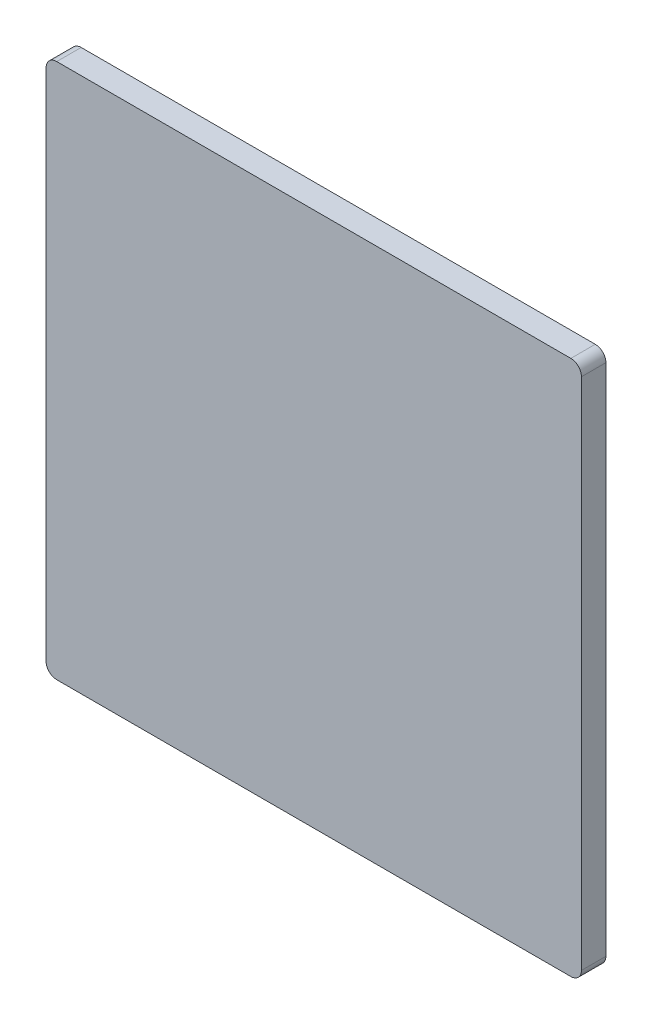
ISO-10303-21;
HEADER;
FILE_DESCRIPTION(('STEP AP214'),'2;1');
FILE_NAME('part.step','',(''),(''),'','','');
FILE_SCHEMA(('AUTOMOTIVE_DESIGN { 1 0 10303 214 1 1 1 1 }'));
ENDSEC;
DATA;
#1=APPLICATION_CONTEXT('core data for automotive mechanical design processes');
#2=APPLICATION_PROTOCOL_DEFINITION('international standard','automotive_design',2000,#1);
#3=PRODUCT_CONTEXT('',#1,'mechanical');
#4=PRODUCT('Part','Part','',(#3));
#5=PRODUCT_RELATED_PRODUCT_CATEGORY('part','',(#4));
#6=PRODUCT_DEFINITION_FORMATION('','',#4);
#7=PRODUCT_DEFINITION_CONTEXT('part definition',#1,'design');
#8=PRODUCT_DEFINITION('design','',#6,#7);
#9=PRODUCT_DEFINITION_SHAPE('','',#8);
#10=(LENGTH_UNIT() NAMED_UNIT(*) SI_UNIT(.MILLI.,.METRE.));
#11=(NAMED_UNIT(*) PLANE_ANGLE_UNIT() SI_UNIT($,.RADIAN.));
#12=(NAMED_UNIT(*) SI_UNIT($,.STERADIAN.) SOLID_ANGLE_UNIT());
#13=UNCERTAINTY_MEASURE_WITH_UNIT(LENGTH_MEASURE(1.E-05),#10,'distance_accuracy_value','');
#14=(GEOMETRIC_REPRESENTATION_CONTEXT(3) GLOBAL_UNCERTAINTY_ASSIGNED_CONTEXT((#13)) GLOBAL_UNIT_ASSIGNED_CONTEXT((#10,
#11,#12)) REPRESENTATION_CONTEXT('',''));
#15=CARTESIAN_POINT('',(0.,0.,0.));
#16=DIRECTION('',(0.,0.,1.));
#17=DIRECTION('',(1.,0.,0.));
#18=AXIS2_PLACEMENT_3D('',#15,#16,#17);
#19=CARTESIAN_POINT('',(12.6,-12.6,1.15));
#20=DIRECTION('',(-1.,0.,0.));
#21=DIRECTION('',(0.,0.,1.));
#22=AXIS2_PLACEMENT_3D('',#19,#20,#21);
#23=PLANE('',#22);
#24=DIRECTION('',(0.,1.,0.));
#25=VECTOR('',#24,1.);
#26=CARTESIAN_POINT('',(12.6,-12.6,1.15));
#27=LINE('',#26,#25);
#28=CARTESIAN_POINT('',(12.6,-12.1,1.15));
#29=VERTEX_POINT('',#28);
#30=CARTESIAN_POINT('',(12.6,12.1,1.15));
#31=VERTEX_POINT('',#30);
#32=EDGE_CURVE('E119',#29,#31,#27,.T.);
#33=ORIENTED_EDGE('',*,*,#32,.F.);
#34=DIRECTION('',(0.,0.,-1.));
#35=VECTOR('',#34,1.);
#36=CARTESIAN_POINT('',(12.6,-12.1,1.15));
#37=LINE('',#36,#35);
#38=CARTESIAN_POINT('',(12.6,-12.1,0.));
#39=VERTEX_POINT('',#38);
#40=EDGE_CURVE('E104',#29,#39,#37,.T.);
#41=ORIENTED_EDGE('',*,*,#40,.T.);
#42=DIRECTION('',(0.,1.,0.));
#43=VECTOR('',#42,1.);
#44=CARTESIAN_POINT('',(12.6,-12.6,0.));
#45=LINE('',#44,#43);
#46=CARTESIAN_POINT('',(12.6,12.1,0.));
#47=VERTEX_POINT('',#46);
#48=EDGE_CURVE('E116',#39,#47,#45,.T.);
#49=ORIENTED_EDGE('',*,*,#48,.T.);
#50=DIRECTION('',(0.,0.,-1.));
#51=VECTOR('',#50,1.);
#52=CARTESIAN_POINT('',(12.6,12.1,1.15));
#53=LINE('',#52,#51);
#54=EDGE_CURVE('E121',#47,#31,#53,.F.);
#55=ORIENTED_EDGE('',*,*,#54,.T.);
#56=EDGE_LOOP('',(#33,#41,#49,#55));
#57=FACE_BOUND('',#56,.T.);
#58=ADVANCED_FACE('F34',(#57),#23,.F.);
#59=CARTESIAN_POINT('',(-12.6,12.6,1.15));
#60=DIRECTION('',(0.,-1.,0.));
#61=DIRECTION('',(0.,0.,-1.));
#62=AXIS2_PLACEMENT_3D('',#59,#60,#61);
#63=PLANE('',#62);
#64=DIRECTION('',(-1.,0.,0.));
#65=VECTOR('',#64,1.);
#66=CARTESIAN_POINT('',(-12.6,12.6,0.));
#67=LINE('',#66,#65);
#68=CARTESIAN_POINT('',(12.1,12.6,0.));
#69=VERTEX_POINT('',#68);
#70=CARTESIAN_POINT('',(-12.1,12.6,0.));
#71=VERTEX_POINT('',#70);
#72=EDGE_CURVE('E125',#69,#71,#67,.T.);
#73=ORIENTED_EDGE('',*,*,#72,.T.);
#74=DIRECTION('',(0.,0.,-1.));
#75=VECTOR('',#74,1.);
#76=CARTESIAN_POINT('',(-12.1,12.6,1.15));
#77=LINE('',#76,#75);
#78=CARTESIAN_POINT('',(-12.1,12.6,1.15));
#79=VERTEX_POINT('',#78);
#80=EDGE_CURVE('E11',#71,#79,#77,.F.);
#81=ORIENTED_EDGE('',*,*,#80,.T.);
#82=DIRECTION('',(-1.,0.,0.));
#83=VECTOR('',#82,1.);
#84=CARTESIAN_POINT('',(-12.6,12.6,1.15));
#85=LINE('',#84,#83);
#86=CARTESIAN_POINT('',(12.1,12.6,1.15));
#87=VERTEX_POINT('',#86);
#88=EDGE_CURVE('E161',#87,#79,#85,.T.);
#89=ORIENTED_EDGE('',*,*,#88,.F.);
#90=DIRECTION('',(0.,0.,-1.));
#91=VECTOR('',#90,1.);
#92=CARTESIAN_POINT('',(12.1,12.6,1.15));
#93=LINE('',#92,#91);
#94=EDGE_CURVE('E42',#87,#69,#93,.T.);
#95=ORIENTED_EDGE('',*,*,#94,.T.);
#96=EDGE_LOOP('',(#73,#81,#89,#95));
#97=FACE_BOUND('',#96,.T.);
#98=ADVANCED_FACE('F159',(#97),#63,.F.);
#99=CARTESIAN_POINT('',(-12.6,-12.6,1.15));
#100=DIRECTION('',(1.,0.,0.));
#101=DIRECTION('',(0.,0.,-1.));
#102=AXIS2_PLACEMENT_3D('',#99,#100,#101);
#103=PLANE('',#102);
#104=DIRECTION('',(0.,-1.,0.));
#105=VECTOR('',#104,1.);
#106=CARTESIAN_POINT('',(-12.6,-12.6,0.));
#107=LINE('',#106,#105);
#108=CARTESIAN_POINT('',(-12.6,12.1,0.));
#109=VERTEX_POINT('',#108);
#110=CARTESIAN_POINT('',(-12.6,-12.1,0.));
#111=VERTEX_POINT('',#110);
#112=EDGE_CURVE('E128',#109,#111,#107,.T.);
#113=ORIENTED_EDGE('',*,*,#112,.T.);
#114=DIRECTION('',(0.,0.,-1.));
#115=VECTOR('',#114,1.);
#116=CARTESIAN_POINT('',(-12.6,-12.1,1.15));
#117=LINE('',#116,#115);
#118=CARTESIAN_POINT('',(-12.6,-12.1,1.15));
#119=VERTEX_POINT('',#118);
#120=EDGE_CURVE('E49',#111,#119,#117,.F.);
#121=ORIENTED_EDGE('',*,*,#120,.T.);
#122=DIRECTION('',(0.,-1.,0.));
#123=VECTOR('',#122,1.);
#124=CARTESIAN_POINT('',(-12.6,-12.6,1.15));
#125=LINE('',#124,#123);
#126=CARTESIAN_POINT('',(-12.6,12.1,1.15));
#127=VERTEX_POINT('',#126);
#128=EDGE_CURVE('E169',#127,#119,#125,.T.);
#129=ORIENTED_EDGE('',*,*,#128,.F.);
#130=DIRECTION('',(0.,0.,-1.));
#131=VECTOR('',#130,1.);
#132=CARTESIAN_POINT('',(-12.6,12.1,1.15));
#133=LINE('',#132,#131);
#134=EDGE_CURVE('E152',#127,#109,#133,.T.);
#135=ORIENTED_EDGE('',*,*,#134,.T.);
#136=EDGE_LOOP('',(#113,#121,#129,#135));
#137=FACE_BOUND('',#136,.T.);
#138=ADVANCED_FACE('F168',(#137),#103,.F.);
#139=CARTESIAN_POINT('',(-12.6,-12.6,1.15));
#140=DIRECTION('',(0.,1.,0.));
#141=DIRECTION('',(0.,0.,1.));
#142=AXIS2_PLACEMENT_3D('',#139,#140,#141);
#143=PLANE('',#142);
#144=DIRECTION('',(1.,0.,0.));
#145=VECTOR('',#144,1.);
#146=CARTESIAN_POINT('',(-12.6,-12.6,0.));
#147=LINE('',#146,#145);
#148=CARTESIAN_POINT('',(-12.1,-12.6,0.));
#149=VERTEX_POINT('',#148);
#150=CARTESIAN_POINT('',(12.1,-12.6,0.));
#151=VERTEX_POINT('',#150);
#152=EDGE_CURVE('E135',#149,#151,#147,.T.);
#153=ORIENTED_EDGE('',*,*,#152,.T.);
#154=DIRECTION('',(0.,0.,-1.));
#155=VECTOR('',#154,1.);
#156=CARTESIAN_POINT('',(12.1,-12.6,1.15));
#157=LINE('',#156,#155);
#158=CARTESIAN_POINT('',(12.1,-12.6,1.15));
#159=VERTEX_POINT('',#158);
#160=EDGE_CURVE('E105',#151,#159,#157,.F.);
#161=ORIENTED_EDGE('',*,*,#160,.T.);
#162=DIRECTION('',(1.,0.,0.));
#163=VECTOR('',#162,1.);
#164=CARTESIAN_POINT('',(-12.6,-12.6,1.15));
#165=LINE('',#164,#163);
#166=CARTESIAN_POINT('',(-12.1,-12.6,1.15));
#167=VERTEX_POINT('',#166);
#168=EDGE_CURVE('E131',#167,#159,#165,.T.);
#169=ORIENTED_EDGE('',*,*,#168,.F.);
#170=DIRECTION('',(0.,0.,-1.));
#171=VECTOR('',#170,1.);
#172=CARTESIAN_POINT('',(-12.1,-12.6,1.15));
#173=LINE('',#172,#171);
#174=EDGE_CURVE('E110',#167,#149,#173,.T.);
#175=ORIENTED_EDGE('',*,*,#174,.T.);
#176=EDGE_LOOP('',(#153,#161,#169,#175));
#177=FACE_BOUND('',#176,.T.);
#178=ADVANCED_FACE('F197',(#177),#143,.F.);
#179=CARTESIAN_POINT('',(0.,0.,1.15));
#180=DIRECTION('',(0.,0.,-1.));
#181=DIRECTION('',(-1.,0.,0.));
#182=AXIS2_PLACEMENT_3D('',#179,#180,#181);
#183=PLANE('',#182);
#184=ORIENTED_EDGE('',*,*,#168,.T.);
#185=CARTESIAN_POINT('',(12.1,-12.1,1.15));
#186=DIRECTION('',(0.,0.,-1.));
#187=DIRECTION('',(-1.,0.,0.));
#188=AXIS2_PLACEMENT_3D('',#185,#186,#187);
#189=CIRCLE('',#188,0.5);
#190=EDGE_CURVE('E150',#159,#29,#189,.F.);
#191=ORIENTED_EDGE('',*,*,#190,.T.);
#192=ORIENTED_EDGE('',*,*,#32,.T.);
#193=CARTESIAN_POINT('',(12.1,12.1,1.15));
#194=DIRECTION('',(0.,0.,-1.));
#195=DIRECTION('',(-1.,0.,0.));
#196=AXIS2_PLACEMENT_3D('',#193,#194,#195);
#197=CIRCLE('',#196,0.5);
#198=EDGE_CURVE('E145',#31,#87,#197,.F.);
#199=ORIENTED_EDGE('',*,*,#198,.T.);
#200=ORIENTED_EDGE('',*,*,#88,.T.);
#201=CARTESIAN_POINT('',(-12.1,12.1,1.15));
#202=DIRECTION('',(0.,0.,-1.));
#203=DIRECTION('',(-1.,0.,0.));
#204=AXIS2_PLACEMENT_3D('',#201,#202,#203);
#205=CIRCLE('',#204,0.5);
#206=EDGE_CURVE('E56',#79,#127,#205,.F.);
#207=ORIENTED_EDGE('',*,*,#206,.T.);
#208=ORIENTED_EDGE('',*,*,#128,.T.);
#209=CARTESIAN_POINT('',(-12.1,-12.1,1.15));
#210=DIRECTION('',(0.,0.,-1.));
#211=DIRECTION('',(-1.,0.,0.));
#212=AXIS2_PLACEMENT_3D('',#209,#210,#211);
#213=CIRCLE('',#212,0.5);
#214=EDGE_CURVE('E148',#119,#167,#213,.F.);
#215=ORIENTED_EDGE('',*,*,#214,.T.);
#216=EDGE_LOOP('',(#184,#191,#192,#199,#200,#207,#208,#215));
#217=FACE_BOUND('',#216,.T.);
#218=ADVANCED_FACE('F174',(#217),#183,.F.);
#219=CARTESIAN_POINT('',(0.,0.,0.));
#220=DIRECTION('',(0.,0.,-1.));
#221=DIRECTION('',(-1.,0.,0.));
#222=AXIS2_PLACEMENT_3D('',#219,#220,#221);
#223=PLANE('',#222);
#224=ORIENTED_EDGE('',*,*,#48,.F.);
#225=CARTESIAN_POINT('',(12.1,-12.1,0.));
#226=DIRECTION('',(0.,0.,-1.));
#227=DIRECTION('',(-1.,0.,0.));
#228=AXIS2_PLACEMENT_3D('',#225,#226,#227);
#229=CIRCLE('',#228,0.5);
#230=EDGE_CURVE('E100',#39,#151,#229,.T.);
#231=ORIENTED_EDGE('',*,*,#230,.T.);
#232=ORIENTED_EDGE('',*,*,#152,.F.);
#233=CARTESIAN_POINT('',(-12.1,-12.1,0.));
#234=DIRECTION('',(0.,0.,-1.));
#235=DIRECTION('',(-1.,0.,0.));
#236=AXIS2_PLACEMENT_3D('',#233,#234,#235);
#237=CIRCLE('',#236,0.5);
#238=EDGE_CURVE('E111',#149,#111,#237,.T.);
#239=ORIENTED_EDGE('',*,*,#238,.T.);
#240=ORIENTED_EDGE('',*,*,#112,.F.);
#241=CARTESIAN_POINT('',(-12.1,12.1,0.));
#242=DIRECTION('',(0.,0.,-1.));
#243=DIRECTION('',(-1.,0.,0.));
#244=AXIS2_PLACEMENT_3D('',#241,#242,#243);
#245=CIRCLE('',#244,0.5);
#246=EDGE_CURVE('E139',#109,#71,#245,.T.);
#247=ORIENTED_EDGE('',*,*,#246,.T.);
#248=ORIENTED_EDGE('',*,*,#72,.F.);
#249=CARTESIAN_POINT('',(12.1,12.1,0.));
#250=DIRECTION('',(0.,0.,-1.));
#251=DIRECTION('',(-1.,0.,0.));
#252=AXIS2_PLACEMENT_3D('',#249,#250,#251);
#253=CIRCLE('',#252,0.5);
#254=EDGE_CURVE('E120',#69,#47,#253,.T.);
#255=ORIENTED_EDGE('',*,*,#254,.T.);
#256=EDGE_LOOP('',(#224,#231,#232,#239,#240,#247,#248,#255));
#257=FACE_BOUND('',#256,.T.);
#258=ADVANCED_FACE('F123',(#257),#223,.T.);
#259=CARTESIAN_POINT('',(12.1,-12.1,1.15));
#260=DIRECTION('',(0.,0.,-1.));
#261=DIRECTION('',(-1.,0.,0.));
#262=AXIS2_PLACEMENT_3D('',#259,#260,#261);
#263=CYLINDRICAL_SURFACE('',#262,0.5);
#264=ORIENTED_EDGE('',*,*,#190,.F.);
#265=ORIENTED_EDGE('',*,*,#160,.F.);
#266=ORIENTED_EDGE('',*,*,#230,.F.);
#267=ORIENTED_EDGE('',*,*,#40,.F.);
#268=EDGE_LOOP('',(#264,#265,#266,#267));
#269=FACE_BOUND('',#268,.T.);
#270=ADVANCED_FACE('F103',(#269),#263,.T.);
#271=CARTESIAN_POINT('',(-12.1,-12.1,1.15));
#272=DIRECTION('',(0.,0.,-1.));
#273=DIRECTION('',(-1.,0.,0.));
#274=AXIS2_PLACEMENT_3D('',#271,#272,#273);
#275=CYLINDRICAL_SURFACE('',#274,0.5);
#276=ORIENTED_EDGE('',*,*,#214,.F.);
#277=ORIENTED_EDGE('',*,*,#120,.F.);
#278=ORIENTED_EDGE('',*,*,#238,.F.);
#279=ORIENTED_EDGE('',*,*,#174,.F.);
#280=EDGE_LOOP('',(#276,#277,#278,#279));
#281=FACE_BOUND('',#280,.T.);
#282=ADVANCED_FACE('F179',(#281),#275,.T.);
#283=CARTESIAN_POINT('',(-12.1,12.1,1.15));
#284=DIRECTION('',(0.,0.,-1.));
#285=DIRECTION('',(-1.,0.,0.));
#286=AXIS2_PLACEMENT_3D('',#283,#284,#285);
#287=CYLINDRICAL_SURFACE('',#286,0.5);
#288=ORIENTED_EDGE('',*,*,#206,.F.);
#289=ORIENTED_EDGE('',*,*,#80,.F.);
#290=ORIENTED_EDGE('',*,*,#246,.F.);
#291=ORIENTED_EDGE('',*,*,#134,.F.);
#292=EDGE_LOOP('',(#288,#289,#290,#291));
#293=FACE_BOUND('',#292,.T.);
#294=ADVANCED_FACE('F167',(#293),#287,.T.);
#295=CARTESIAN_POINT('',(12.1,12.1,1.15));
#296=DIRECTION('',(0.,0.,-1.));
#297=DIRECTION('',(-1.,0.,0.));
#298=AXIS2_PLACEMENT_3D('',#295,#296,#297);
#299=CYLINDRICAL_SURFACE('',#298,0.5);
#300=ORIENTED_EDGE('',*,*,#198,.F.);
#301=ORIENTED_EDGE('',*,*,#54,.F.);
#302=ORIENTED_EDGE('',*,*,#254,.F.);
#303=ORIENTED_EDGE('',*,*,#94,.F.);
#304=EDGE_LOOP('',(#300,#301,#302,#303));
#305=FACE_BOUND('',#304,.T.);
#306=ADVANCED_FACE('F36',(#305),#299,.T.);
#307=CLOSED_SHELL('',(#58,#98,#138,#178,#218,#258,#270,#282,#294,#306));
#308=MANIFOLD_SOLID_BREP('B2',#307);
#309=ADVANCED_BREP_SHAPE_REPRESENTATION('',(#18,#308),#14);
#310=SHAPE_DEFINITION_REPRESENTATION(#9,#309);
ENDSEC;
END-ISO-10303-21;
